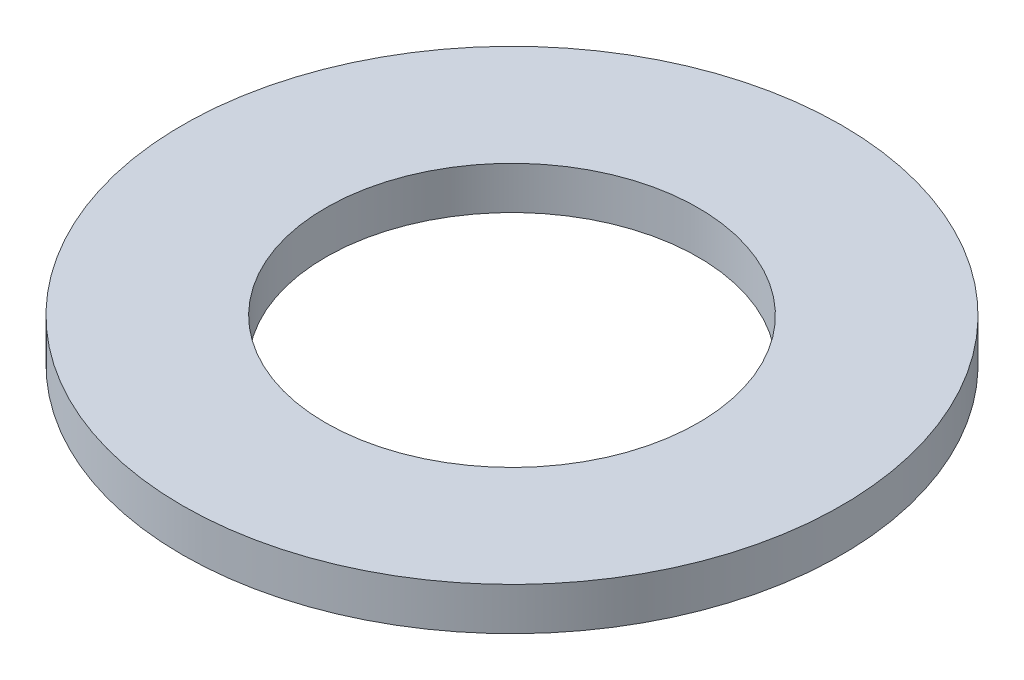
ISO-10303-21;
HEADER;
FILE_DESCRIPTION(('STEP AP214'),'2;1');
FILE_NAME('part.step','',(''),(''),'','','');
FILE_SCHEMA(('AUTOMOTIVE_DESIGN { 1 0 10303 214 1 1 1 1 }'));
ENDSEC;
DATA;
#1=APPLICATION_CONTEXT('core data for automotive mechanical design processes');
#2=APPLICATION_PROTOCOL_DEFINITION('international standard','automotive_design',2000,#1);
#3=PRODUCT_CONTEXT('',#1,'mechanical');
#4=PRODUCT('Part','Part','',(#3));
#5=PRODUCT_RELATED_PRODUCT_CATEGORY('part','',(#4));
#6=PRODUCT_DEFINITION_FORMATION('','',#4);
#7=PRODUCT_DEFINITION_CONTEXT('part definition',#1,'design');
#8=PRODUCT_DEFINITION('design','',#6,#7);
#9=PRODUCT_DEFINITION_SHAPE('','',#8);
#10=(LENGTH_UNIT() NAMED_UNIT(*) SI_UNIT(.MILLI.,.METRE.));
#11=(NAMED_UNIT(*) PLANE_ANGLE_UNIT() SI_UNIT($,.RADIAN.));
#12=(NAMED_UNIT(*) SI_UNIT($,.STERADIAN.) SOLID_ANGLE_UNIT());
#13=UNCERTAINTY_MEASURE_WITH_UNIT(LENGTH_MEASURE(1.E-05),#10,'distance_accuracy_value','');
#14=(GEOMETRIC_REPRESENTATION_CONTEXT(3) GLOBAL_UNCERTAINTY_ASSIGNED_CONTEXT((#13)) GLOBAL_UNIT_ASSIGNED_CONTEXT((#10,
#11,#12)) REPRESENTATION_CONTEXT('',''));
#15=CARTESIAN_POINT('',(0.,0.,0.));
#16=DIRECTION('',(0.,0.,1.));
#17=DIRECTION('',(1.,0.,0.));
#18=AXIS2_PLACEMENT_3D('',#15,#16,#17);
#19=CARTESIAN_POINT('',(0.,3.,0.));
#20=DIRECTION('',(0.,1.,0.));
#21=DIRECTION('',(0.,0.,1.));
#22=AXIS2_PLACEMENT_3D('',#19,#20,#21);
#23=PLANE('',#22);
#24=CARTESIAN_POINT('',(0.,3.,0.));
#25=DIRECTION('',(0.,1.,0.));
#26=DIRECTION('',(0.,0.,1.));
#27=AXIS2_PLACEMENT_3D('',#24,#25,#26);
#28=CIRCLE('',#27,23.1769230769231);
#29=CARTESIAN_POINT('',(0.,3.,23.1769230769231));
#30=VERTEX_POINT('',#29);
#31=EDGE_CURVE('E10',#30,#30,#28,.T.);
#32=ORIENTED_EDGE('',*,*,#31,.T.);
#33=EDGE_LOOP('',(#32));
#34=FACE_BOUND('',#33,.T.);
#35=CARTESIAN_POINT('',(0.,3.,0.));
#36=DIRECTION('',(0.,1.,0.));
#37=DIRECTION('',(0.,0.,1.));
#38=AXIS2_PLACEMENT_3D('',#35,#36,#37);
#39=CIRCLE('',#38,13.1);
#40=CARTESIAN_POINT('',(0.,3.,13.1));
#41=VERTEX_POINT('',#40);
#42=EDGE_CURVE('E50',#41,#41,#39,.T.);
#43=ORIENTED_EDGE('',*,*,#42,.F.);
#44=EDGE_LOOP('',(#43));
#45=FACE_BOUND('',#44,.T.);
#46=ADVANCED_FACE('F37',(#34,#45),#23,.T.);
#47=CARTESIAN_POINT('',(0.,0.,0.));
#48=DIRECTION('',(0.,1.,0.));
#49=DIRECTION('',(0.,0.,1.));
#50=AXIS2_PLACEMENT_3D('',#47,#48,#49);
#51=PLANE('',#50);
#52=CARTESIAN_POINT('',(0.,0.,0.));
#53=DIRECTION('',(0.,1.,0.));
#54=DIRECTION('',(0.,0.,1.));
#55=AXIS2_PLACEMENT_3D('',#52,#53,#54);
#56=CIRCLE('',#55,23.1769230769231);
#57=CARTESIAN_POINT('',(0.,0.,23.1769230769231));
#58=VERTEX_POINT('',#57);
#59=EDGE_CURVE('E41',#58,#58,#56,.T.);
#60=ORIENTED_EDGE('',*,*,#59,.F.);
#61=EDGE_LOOP('',(#60));
#62=FACE_BOUND('',#61,.T.);
#63=CARTESIAN_POINT('',(0.,0.,0.));
#64=DIRECTION('',(0.,1.,0.));
#65=DIRECTION('',(0.,0.,1.));
#66=AXIS2_PLACEMENT_3D('',#63,#64,#65);
#67=CIRCLE('',#66,13.1);
#68=CARTESIAN_POINT('',(0.,0.,13.1));
#69=VERTEX_POINT('',#68);
#70=EDGE_CURVE('E52',#69,#69,#67,.T.);
#71=ORIENTED_EDGE('',*,*,#70,.T.);
#72=EDGE_LOOP('',(#71));
#73=FACE_BOUND('',#72,.T.);
#74=ADVANCED_FACE('F64',(#62,#73),#51,.F.);
#75=CARTESIAN_POINT('',(0.,3.,0.));
#76=DIRECTION('',(0.,-1.,0.));
#77=DIRECTION('',(0.,0.,-1.));
#78=AXIS2_PLACEMENT_3D('',#75,#76,#77);
#79=CYLINDRICAL_SURFACE('',#78,23.1769230769231);
#80=ORIENTED_EDGE('',*,*,#31,.F.);
#81=EDGE_LOOP('',(#80));
#82=FACE_BOUND('',#81,.T.);
#83=ORIENTED_EDGE('',*,*,#59,.T.);
#84=EDGE_LOOP('',(#83));
#85=FACE_BOUND('',#84,.T.);
#86=ADVANCED_FACE('F39',(#82,#85),#79,.T.);
#87=CARTESIAN_POINT('',(0.,3.,0.));
#88=DIRECTION('',(0.,-1.,0.));
#89=DIRECTION('',(0.,0.,-1.));
#90=AXIS2_PLACEMENT_3D('',#87,#88,#89);
#91=CYLINDRICAL_SURFACE('',#90,13.1);
#92=ORIENTED_EDGE('',*,*,#42,.T.);
#93=EDGE_LOOP('',(#92));
#94=FACE_BOUND('',#93,.T.);
#95=ORIENTED_EDGE('',*,*,#70,.F.);
#96=EDGE_LOOP('',(#95));
#97=FACE_BOUND('',#96,.T.);
#98=ADVANCED_FACE('F60',(#94,#97),#91,.F.);
#99=CLOSED_SHELL('',(#46,#74,#86,#98));
#100=MANIFOLD_SOLID_BREP('B2',#99);
#101=ADVANCED_BREP_SHAPE_REPRESENTATION('',(#18,#100),#14);
#102=SHAPE_DEFINITION_REPRESENTATION(#9,#101);
ENDSEC;
END-ISO-10303-21;
